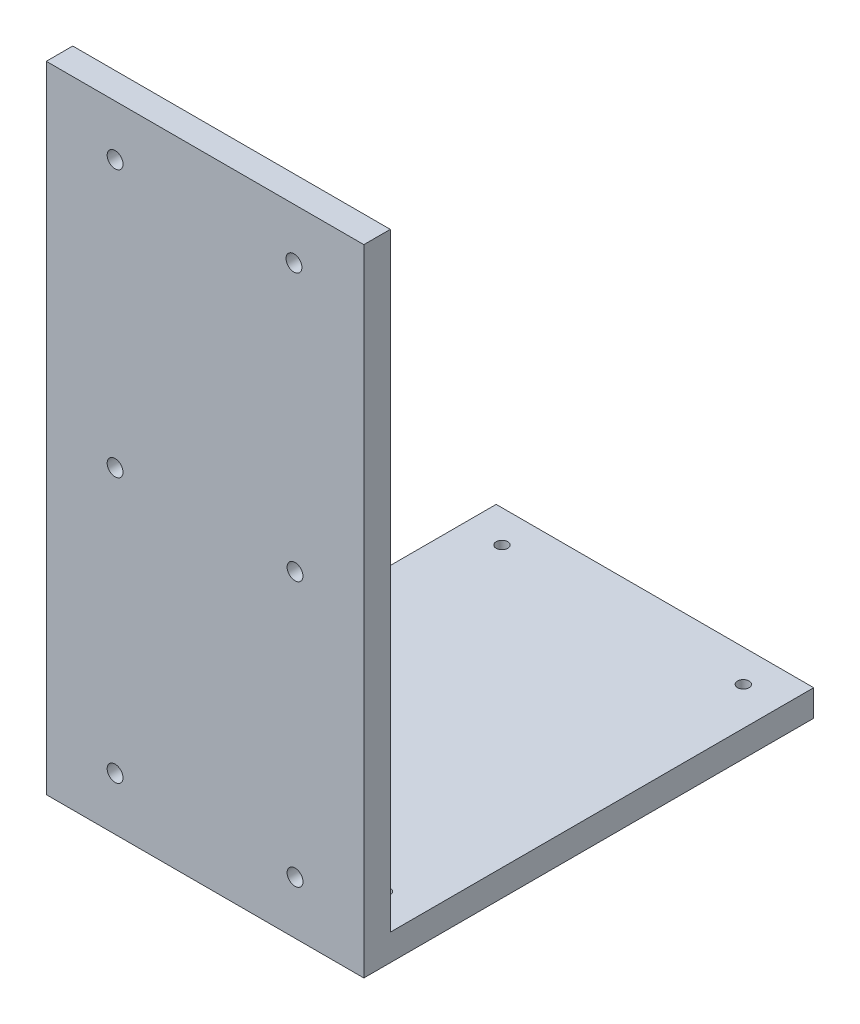
ISO-10303-21;
HEADER;
FILE_DESCRIPTION(('STEP AP214'),'2;1');
FILE_NAME('part.step','',(''),(''),'','','');
FILE_SCHEMA(('AUTOMOTIVE_DESIGN { 1 0 10303 214 1 1 1 1 }'));
ENDSEC;
DATA;
#1=APPLICATION_CONTEXT('core data for automotive mechanical design processes');
#2=APPLICATION_PROTOCOL_DEFINITION('international standard','automotive_design',2000,#1);
#3=PRODUCT_CONTEXT('',#1,'mechanical');
#4=PRODUCT('Part','Part','',(#3));
#5=PRODUCT_RELATED_PRODUCT_CATEGORY('part','',(#4));
#6=PRODUCT_DEFINITION_FORMATION('','',#4);
#7=PRODUCT_DEFINITION_CONTEXT('part definition',#1,'design');
#8=PRODUCT_DEFINITION('design','',#6,#7);
#9=PRODUCT_DEFINITION_SHAPE('','',#8);
#10=(LENGTH_UNIT() NAMED_UNIT(*) SI_UNIT(.MILLI.,.METRE.));
#11=(NAMED_UNIT(*) PLANE_ANGLE_UNIT() SI_UNIT($,.RADIAN.));
#12=(NAMED_UNIT(*) SI_UNIT($,.STERADIAN.) SOLID_ANGLE_UNIT());
#13=UNCERTAINTY_MEASURE_WITH_UNIT(LENGTH_MEASURE(1.E-05),#10,'distance_accuracy_value','');
#14=(GEOMETRIC_REPRESENTATION_CONTEXT(3) GLOBAL_UNCERTAINTY_ASSIGNED_CONTEXT((#13)) GLOBAL_UNIT_ASSIGNED_CONTEXT((#10,
#11,#12)) REPRESENTATION_CONTEXT('',''));
#15=CARTESIAN_POINT('',(0.,0.,0.));
#16=DIRECTION('',(0.,0.,1.));
#17=DIRECTION('',(1.,0.,0.));
#18=AXIS2_PLACEMENT_3D('',#15,#16,#17);
#19=CARTESIAN_POINT('',(-38.1,0.,6.35));
#20=DIRECTION('',(0.,1.,0.));
#21=DIRECTION('',(0.,0.,1.));
#22=AXIS2_PLACEMENT_3D('',#19,#20,#21);
#23=PLANE('',#22);
#24=CARTESIAN_POINT('',(28.956,0.,-7.74700000000002));
#25=DIRECTION('',(0.,1.,0.));
#26=DIRECTION('',(0.,0.,1.));
#27=AXIS2_PLACEMENT_3D('',#24,#25,#26);
#28=CIRCLE('',#27,1.39700000000008);
#29=CARTESIAN_POINT('',(28.956,0.,-6.34999999999994));
#30=VERTEX_POINT('',#29);
#31=EDGE_CURVE('E283',#30,#30,#28,.T.);
#32=ORIENTED_EDGE('',*,*,#31,.T.);
#33=EDGE_LOOP('',(#32));
#34=FACE_BOUND('',#33,.T.);
#35=CARTESIAN_POINT('',(-28.956,0.,-93.853));
#36=DIRECTION('',(0.,1.,0.));
#37=DIRECTION('',(0.,0.,1.));
#38=AXIS2_PLACEMENT_3D('',#35,#36,#37);
#39=CIRCLE('',#38,1.397);
#40=CARTESIAN_POINT('',(-28.956,0.,-92.456));
#41=VERTEX_POINT('',#40);
#42=EDGE_CURVE('E277',#41,#41,#39,.T.);
#43=ORIENTED_EDGE('',*,*,#42,.T.);
#44=EDGE_LOOP('',(#43));
#45=FACE_BOUND('',#44,.T.);
#46=DIRECTION('',(0.,0.,-1.));
#47=VECTOR('',#46,1.);
#48=CARTESIAN_POINT('',(-38.1,0.,6.35));
#49=LINE('',#48,#47);
#50=CARTESIAN_POINT('',(-38.1,0.,6.35));
#51=VERTEX_POINT('',#50);
#52=CARTESIAN_POINT('',(-38.1,0.,-101.6));
#53=VERTEX_POINT('',#52);
#54=EDGE_CURVE('E11',#51,#53,#49,.T.);
#55=ORIENTED_EDGE('',*,*,#54,.T.);
#56=DIRECTION('',(1.,0.,0.));
#57=VECTOR('',#56,1.);
#58=CARTESIAN_POINT('',(38.1,0.,-101.6));
#59=LINE('',#58,#57);
#60=CARTESIAN_POINT('',(38.1,0.,-101.6));
#61=VERTEX_POINT('',#60);
#62=EDGE_CURVE('E118',#53,#61,#59,.T.);
#63=ORIENTED_EDGE('',*,*,#62,.T.);
#64=DIRECTION('',(0.,0.,-1.));
#65=VECTOR('',#64,1.);
#66=CARTESIAN_POINT('',(38.1,0.,6.35));
#67=LINE('',#66,#65);
#68=CARTESIAN_POINT('',(38.1,0.,6.35));
#69=VERTEX_POINT('',#68);
#70=EDGE_CURVE('E49',#69,#61,#67,.T.);
#71=ORIENTED_EDGE('',*,*,#70,.F.);
#72=DIRECTION('',(1.,0.,0.));
#73=VECTOR('',#72,1.);
#74=CARTESIAN_POINT('',(-38.1,0.,6.35));
#75=LINE('',#74,#73);
#76=EDGE_CURVE('E88',#51,#69,#75,.T.);
#77=ORIENTED_EDGE('',*,*,#76,.F.);
#78=EDGE_LOOP('',(#55,#63,#71,#77));
#79=FACE_BOUND('',#78,.T.);
#80=CARTESIAN_POINT('',(-28.956,0.,-7.74700000000002));
#81=DIRECTION('',(0.,-1.,0.));
#82=DIRECTION('',(0.,0.,-1.));
#83=AXIS2_PLACEMENT_3D('',#80,#81,#82);
#84=CIRCLE('',#83,1.39699999999995);
#85=CARTESIAN_POINT('',(-28.956,0.,-9.14399999999997));
#86=VERTEX_POINT('',#85);
#87=EDGE_CURVE('E289',#86,#86,#84,.T.);
#88=ORIENTED_EDGE('',*,*,#87,.F.);
#89=EDGE_LOOP('',(#88));
#90=FACE_BOUND('',#89,.T.);
#91=CARTESIAN_POINT('',(28.956,0.,-93.853));
#92=DIRECTION('',(0.,1.,0.));
#93=DIRECTION('',(0.,0.,1.));
#94=AXIS2_PLACEMENT_3D('',#91,#92,#93);
#95=CIRCLE('',#94,1.39699999999998);
#96=CARTESIAN_POINT('',(28.956,0.,-92.456));
#97=VERTEX_POINT('',#96);
#98=EDGE_CURVE('E272',#97,#97,#95,.F.);
#99=ORIENTED_EDGE('',*,*,#98,.F.);
#100=EDGE_LOOP('',(#99));
#101=FACE_BOUND('',#100,.T.);
#102=ADVANCED_FACE('F39',(#34,#45,#79,#90,#101),#23,.F.);
#103=CARTESIAN_POINT('',(-38.1,6.35,-101.6));
#104=DIRECTION('',(0.,1.,0.));
#105=DIRECTION('',(0.,0.,1.));
#106=AXIS2_PLACEMENT_3D('',#103,#104,#105);
#107=PLANE('',#106);
#108=CARTESIAN_POINT('',(-28.956,6.35,-7.74700000000002));
#109=DIRECTION('',(0.,-1.,0.));
#110=DIRECTION('',(0.,0.,-1.));
#111=AXIS2_PLACEMENT_3D('',#108,#109,#110);
#112=CIRCLE('',#111,1.39699999999995);
#113=CARTESIAN_POINT('',(-28.956,6.35,-9.14399999999997));
#114=VERTEX_POINT('',#113);
#115=EDGE_CURVE('E280',#114,#114,#112,.T.);
#116=ORIENTED_EDGE('',*,*,#115,.T.);
#117=EDGE_LOOP('',(#116));
#118=FACE_BOUND('',#117,.T.);
#119=CARTESIAN_POINT('',(28.956,6.35,-7.74700000000002));
#120=DIRECTION('',(0.,1.,0.));
#121=DIRECTION('',(0.,0.,1.));
#122=AXIS2_PLACEMENT_3D('',#119,#120,#121);
#123=CIRCLE('',#122,1.39700000000008);
#124=CARTESIAN_POINT('',(28.956,6.35,-6.34999999999994));
#125=VERTEX_POINT('',#124);
#126=EDGE_CURVE('E293',#125,#125,#123,.T.);
#127=ORIENTED_EDGE('',*,*,#126,.F.);
#128=EDGE_LOOP('',(#127));
#129=FACE_BOUND('',#128,.T.);
#130=CARTESIAN_POINT('',(-28.956,6.35,-93.853));
#131=DIRECTION('',(0.,1.,0.));
#132=DIRECTION('',(0.,0.,1.));
#133=AXIS2_PLACEMENT_3D('',#130,#131,#132);
#134=CIRCLE('',#133,1.397);
#135=CARTESIAN_POINT('',(-28.956,6.35,-92.456));
#136=VERTEX_POINT('',#135);
#137=EDGE_CURVE('E271',#136,#136,#134,.T.);
#138=ORIENTED_EDGE('',*,*,#137,.F.);
#139=EDGE_LOOP('',(#138));
#140=FACE_BOUND('',#139,.T.);
#141=DIRECTION('',(-1.,0.,0.));
#142=VECTOR('',#141,1.);
#143=CARTESIAN_POINT('',(-38.1,6.35,0.));
#144=LINE('',#143,#142);
#145=CARTESIAN_POINT('',(38.1,6.35,0.));
#146=VERTEX_POINT('',#145);
#147=CARTESIAN_POINT('',(-38.1,6.35000000000005,0.));
#148=VERTEX_POINT('',#147);
#149=EDGE_CURVE('E126',#146,#148,#144,.T.);
#150=ORIENTED_EDGE('',*,*,#149,.F.);
#151=DIRECTION('',(0.,0.,1.));
#152=VECTOR('',#151,1.);
#153=CARTESIAN_POINT('',(38.1,6.35,-101.6));
#154=LINE('',#153,#152);
#155=CARTESIAN_POINT('',(38.1,6.35,-101.6));
#156=VERTEX_POINT('',#155);
#157=EDGE_CURVE('E138',#156,#146,#154,.T.);
#158=ORIENTED_EDGE('',*,*,#157,.F.);
#159=DIRECTION('',(-1.,0.,0.));
#160=VECTOR('',#159,1.);
#161=CARTESIAN_POINT('',(-38.1,6.35,-101.6));
#162=LINE('',#161,#160);
#163=CARTESIAN_POINT('',(-38.1,6.35,-101.6));
#164=VERTEX_POINT('',#163);
#165=EDGE_CURVE('E120',#156,#164,#162,.T.);
#166=ORIENTED_EDGE('',*,*,#165,.T.);
#167=DIRECTION('',(0.,0.,1.));
#168=VECTOR('',#167,1.);
#169=CARTESIAN_POINT('',(-38.1,6.35,-101.6));
#170=LINE('',#169,#168);
#171=EDGE_CURVE('E57',#164,#148,#170,.T.);
#172=ORIENTED_EDGE('',*,*,#171,.T.);
#173=EDGE_LOOP('',(#150,#158,#166,#172));
#174=FACE_BOUND('',#173,.T.);
#175=CARTESIAN_POINT('',(28.956,6.35,-93.853));
#176=DIRECTION('',(0.,1.,0.));
#177=DIRECTION('',(0.,0.,1.));
#178=AXIS2_PLACEMENT_3D('',#175,#176,#177);
#179=CIRCLE('',#178,1.39699999999998);
#180=CARTESIAN_POINT('',(28.956,6.35,-92.456));
#181=VERTEX_POINT('',#180);
#182=EDGE_CURVE('E268',#181,#181,#179,.F.);
#183=ORIENTED_EDGE('',*,*,#182,.T.);
#184=EDGE_LOOP('',(#183));
#185=FACE_BOUND('',#184,.T.);
#186=ADVANCED_FACE('F212',(#118,#129,#140,#174,#185),#107,.T.);
#187=CARTESIAN_POINT('',(-38.1,152.4,6.35));
#188=DIRECTION('',(1.,0.,0.));
#189=DIRECTION('',(0.,1.,0.));
#190=AXIS2_PLACEMENT_3D('',#187,#188,#189);
#191=PLANE('',#190);
#192=DIRECTION('',(0.,-1.,0.));
#193=VECTOR('',#192,1.);
#194=CARTESIAN_POINT('',(-38.1,152.4,0.));
#195=LINE('',#194,#193);
#196=CARTESIAN_POINT('',(-38.1,152.4,0.));
#197=VERTEX_POINT('',#196);
#198=EDGE_CURVE('E142',#197,#148,#195,.T.);
#199=ORIENTED_EDGE('',*,*,#198,.T.);
#200=ORIENTED_EDGE('',*,*,#171,.F.);
#201=DIRECTION('',(0.,-1.,0.));
#202=VECTOR('',#201,1.);
#203=CARTESIAN_POINT('',(-38.1,0.,-101.6));
#204=LINE('',#203,#202);
#205=EDGE_CURVE('E136',#164,#53,#204,.T.);
#206=ORIENTED_EDGE('',*,*,#205,.T.);
#207=ORIENTED_EDGE('',*,*,#54,.F.);
#208=DIRECTION('',(0.,-1.,0.));
#209=VECTOR('',#208,1.);
#210=CARTESIAN_POINT('',(-38.1,152.4,6.35));
#211=LINE('',#210,#209);
#212=CARTESIAN_POINT('',(-38.1,152.4,6.35));
#213=VERTEX_POINT('',#212);
#214=EDGE_CURVE('E145',#213,#51,#211,.T.);
#215=ORIENTED_EDGE('',*,*,#214,.F.);
#216=DIRECTION('',(0.,0.,-1.));
#217=VECTOR('',#216,1.);
#218=CARTESIAN_POINT('',(-38.1,152.4,6.35));
#219=LINE('',#218,#217);
#220=EDGE_CURVE('E154',#213,#197,#219,.T.);
#221=ORIENTED_EDGE('',*,*,#220,.T.);
#222=EDGE_LOOP('',(#199,#200,#206,#207,#215,#221));
#223=FACE_BOUND('',#222,.T.);
#224=ADVANCED_FACE('F41',(#223),#191,.F.);
#225=CARTESIAN_POINT('',(38.1,152.4,6.35));
#226=DIRECTION('',(-1.,0.,0.));
#227=DIRECTION('',(0.,-1.,0.));
#228=AXIS2_PLACEMENT_3D('',#225,#226,#227);
#229=PLANE('',#228);
#230=ORIENTED_EDGE('',*,*,#70,.T.);
#231=DIRECTION('',(0.,1.,0.));
#232=VECTOR('',#231,1.);
#233=CARTESIAN_POINT('',(38.1,6.35,-101.6));
#234=LINE('',#233,#232);
#235=EDGE_CURVE('E106',#61,#156,#234,.T.);
#236=ORIENTED_EDGE('',*,*,#235,.T.);
#237=ORIENTED_EDGE('',*,*,#157,.T.);
#238=DIRECTION('',(0.,1.,0.));
#239=VECTOR('',#238,1.);
#240=CARTESIAN_POINT('',(38.1,152.4,0.));
#241=LINE('',#240,#239);
#242=CARTESIAN_POINT('',(38.1,152.4,0.));
#243=VERTEX_POINT('',#242);
#244=EDGE_CURVE('E158',#146,#243,#241,.T.);
#245=ORIENTED_EDGE('',*,*,#244,.T.);
#246=DIRECTION('',(0.,0.,-1.));
#247=VECTOR('',#246,1.);
#248=CARTESIAN_POINT('',(38.1,152.4,6.35));
#249=LINE('',#248,#247);
#250=CARTESIAN_POINT('',(38.1,152.4,6.35));
#251=VERTEX_POINT('',#250);
#252=EDGE_CURVE('E111',#251,#243,#249,.T.);
#253=ORIENTED_EDGE('',*,*,#252,.F.);
#254=DIRECTION('',(0.,1.,0.));
#255=VECTOR('',#254,1.);
#256=CARTESIAN_POINT('',(38.1,152.4,6.35));
#257=LINE('',#256,#255);
#258=EDGE_CURVE('E108',#69,#251,#257,.T.);
#259=ORIENTED_EDGE('',*,*,#258,.F.);
#260=EDGE_LOOP('',(#230,#236,#237,#245,#253,#259));
#261=FACE_BOUND('',#260,.T.);
#262=ADVANCED_FACE('F105',(#261),#229,.F.);
#263=CARTESIAN_POINT('',(-38.1,152.4,6.35));
#264=DIRECTION('',(0.,-1.,0.));
#265=DIRECTION('',(0.,0.,-1.));
#266=AXIS2_PLACEMENT_3D('',#263,#264,#265);
#267=PLANE('',#266);
#268=DIRECTION('',(-1.,0.,0.));
#269=VECTOR('',#268,1.);
#270=CARTESIAN_POINT('',(-38.1,152.4,0.));
#271=LINE('',#270,#269);
#272=EDGE_CURVE('E81',#243,#197,#271,.T.);
#273=ORIENTED_EDGE('',*,*,#272,.T.);
#274=ORIENTED_EDGE('',*,*,#220,.F.);
#275=DIRECTION('',(-1.,0.,0.));
#276=VECTOR('',#275,1.);
#277=CARTESIAN_POINT('',(-38.1,152.4,6.35));
#278=LINE('',#277,#276);
#279=EDGE_CURVE('E66',#251,#213,#278,.T.);
#280=ORIENTED_EDGE('',*,*,#279,.F.);
#281=ORIENTED_EDGE('',*,*,#252,.T.);
#282=EDGE_LOOP('',(#273,#274,#280,#281));
#283=FACE_BOUND('',#282,.T.);
#284=ADVANCED_FACE('F224',(#283),#267,.F.);
#285=CARTESIAN_POINT('',(0.,0.,6.35));
#286=DIRECTION('',(0.,0.,1.));
#287=DIRECTION('',(1.,0.,0.));
#288=AXIS2_PLACEMENT_3D('',#285,#286,#287);
#289=PLANE('',#288);
#290=CARTESIAN_POINT('',(21.336,140.208,6.35));
#291=DIRECTION('',(0.,0.,1.));
#292=DIRECTION('',(1.,0.,0.));
#293=AXIS2_PLACEMENT_3D('',#290,#291,#292);
#294=CIRCLE('',#293,1.90499999999999);
#295=CARTESIAN_POINT('',(23.241,140.208,6.35));
#296=VERTEX_POINT('',#295);
#297=EDGE_CURVE('E302',#296,#296,#294,.T.);
#298=ORIENTED_EDGE('',*,*,#297,.F.);
#299=EDGE_LOOP('',(#298));
#300=FACE_BOUND('',#299,.T.);
#301=CARTESIAN_POINT('',(21.59,76.2,6.35));
#302=DIRECTION('',(0.,0.,1.));
#303=DIRECTION('',(1.,0.,0.));
#304=AXIS2_PLACEMENT_3D('',#301,#302,#303);
#305=CIRCLE('',#304,1.90500000000001);
#306=CARTESIAN_POINT('',(23.495,76.2,6.35));
#307=VERTEX_POINT('',#306);
#308=EDGE_CURVE('E305',#307,#307,#305,.T.);
#309=ORIENTED_EDGE('',*,*,#308,.F.);
#310=EDGE_LOOP('',(#309));
#311=FACE_BOUND('',#310,.T.);
#312=CARTESIAN_POINT('',(-21.59,76.2,6.35));
#313=DIRECTION('',(0.,0.,1.));
#314=DIRECTION('',(1.,0.,0.));
#315=AXIS2_PLACEMENT_3D('',#312,#313,#314);
#316=CIRCLE('',#315,1.90500000000001);
#317=CARTESIAN_POINT('',(-19.685,76.2,6.35));
#318=VERTEX_POINT('',#317);
#319=EDGE_CURVE('E251',#318,#318,#316,.T.);
#320=ORIENTED_EDGE('',*,*,#319,.F.);
#321=EDGE_LOOP('',(#320));
#322=FACE_BOUND('',#321,.T.);
#323=CARTESIAN_POINT('',(-21.59,12.7,6.35));
#324=DIRECTION('',(0.,0.,1.));
#325=DIRECTION('',(1.,0.,0.));
#326=AXIS2_PLACEMENT_3D('',#323,#324,#325);
#327=CIRCLE('',#326,1.905);
#328=CARTESIAN_POINT('',(-19.685,12.7,6.35));
#329=VERTEX_POINT('',#328);
#330=EDGE_CURVE('E301',#329,#329,#327,.T.);
#331=ORIENTED_EDGE('',*,*,#330,.F.);
#332=EDGE_LOOP('',(#331));
#333=FACE_BOUND('',#332,.T.);
#334=CARTESIAN_POINT('',(21.59,12.7,6.35));
#335=DIRECTION('',(0.,0.,1.));
#336=DIRECTION('',(1.,0.,0.));
#337=AXIS2_PLACEMENT_3D('',#334,#335,#336);
#338=CIRCLE('',#337,1.905);
#339=CARTESIAN_POINT('',(23.495,12.7,6.35));
#340=VERTEX_POINT('',#339);
#341=EDGE_CURVE('E296',#340,#340,#338,.T.);
#342=ORIENTED_EDGE('',*,*,#341,.F.);
#343=EDGE_LOOP('',(#342));
#344=FACE_BOUND('',#343,.T.);
#345=CARTESIAN_POINT('',(-21.59,140.208,6.35));
#346=DIRECTION('',(0.,0.,1.));
#347=DIRECTION('',(1.,0.,0.));
#348=AXIS2_PLACEMENT_3D('',#345,#346,#347);
#349=CIRCLE('',#348,1.90499999999999);
#350=CARTESIAN_POINT('',(-19.685,140.208,6.35));
#351=VERTEX_POINT('',#350);
#352=EDGE_CURVE('E131',#351,#351,#349,.T.);
#353=ORIENTED_EDGE('',*,*,#352,.F.);
#354=EDGE_LOOP('',(#353));
#355=FACE_BOUND('',#354,.T.);
#356=ORIENTED_EDGE('',*,*,#214,.T.);
#357=ORIENTED_EDGE('',*,*,#76,.T.);
#358=ORIENTED_EDGE('',*,*,#258,.T.);
#359=ORIENTED_EDGE('',*,*,#279,.T.);
#360=EDGE_LOOP('',(#356,#357,#358,#359));
#361=FACE_BOUND('',#360,.T.);
#362=ADVANCED_FACE('F227',(#300,#311,#322,#333,#344,#355,#361),#289,.T.);
#363=CARTESIAN_POINT('',(0.,0.,0.));
#364=DIRECTION('',(0.,0.,1.));
#365=DIRECTION('',(1.,0.,0.));
#366=AXIS2_PLACEMENT_3D('',#363,#364,#365);
#367=PLANE('',#366);
#368=CARTESIAN_POINT('',(21.336,140.208,0.));
#369=DIRECTION('',(0.,0.,1.));
#370=DIRECTION('',(1.,0.,0.));
#371=AXIS2_PLACEMENT_3D('',#368,#369,#370);
#372=CIRCLE('',#371,1.90499999999999);
#373=CARTESIAN_POINT('',(23.241,140.208,0.));
#374=VERTEX_POINT('',#373);
#375=EDGE_CURVE('E43',#374,#374,#372,.T.);
#376=ORIENTED_EDGE('',*,*,#375,.T.);
#377=EDGE_LOOP('',(#376));
#378=FACE_BOUND('',#377,.T.);
#379=CARTESIAN_POINT('',(21.59,76.2,0.));
#380=DIRECTION('',(0.,0.,1.));
#381=DIRECTION('',(1.,0.,0.));
#382=AXIS2_PLACEMENT_3D('',#379,#380,#381);
#383=CIRCLE('',#382,1.90500000000001);
#384=CARTESIAN_POINT('',(23.495,76.2,0.));
#385=VERTEX_POINT('',#384);
#386=EDGE_CURVE('E182',#385,#385,#383,.T.);
#387=ORIENTED_EDGE('',*,*,#386,.T.);
#388=EDGE_LOOP('',(#387));
#389=FACE_BOUND('',#388,.T.);
#390=CARTESIAN_POINT('',(-21.59,76.2,0.));
#391=DIRECTION('',(0.,0.,1.));
#392=DIRECTION('',(1.,0.,0.));
#393=AXIS2_PLACEMENT_3D('',#390,#391,#392);
#394=CIRCLE('',#393,1.90500000000001);
#395=CARTESIAN_POINT('',(-19.685,76.2,0.));
#396=VERTEX_POINT('',#395);
#397=EDGE_CURVE('E179',#396,#396,#394,.T.);
#398=ORIENTED_EDGE('',*,*,#397,.T.);
#399=EDGE_LOOP('',(#398));
#400=FACE_BOUND('',#399,.T.);
#401=CARTESIAN_POINT('',(-21.59,12.7,0.));
#402=DIRECTION('',(0.,0.,1.));
#403=DIRECTION('',(1.,0.,0.));
#404=AXIS2_PLACEMENT_3D('',#401,#402,#403);
#405=CIRCLE('',#404,1.905);
#406=CARTESIAN_POINT('',(-19.685,12.7,0.));
#407=VERTEX_POINT('',#406);
#408=EDGE_CURVE('E175',#407,#407,#405,.T.);
#409=ORIENTED_EDGE('',*,*,#408,.T.);
#410=EDGE_LOOP('',(#409));
#411=FACE_BOUND('',#410,.T.);
#412=CARTESIAN_POINT('',(21.59,12.7,0.));
#413=DIRECTION('',(0.,0.,1.));
#414=DIRECTION('',(1.,0.,0.));
#415=AXIS2_PLACEMENT_3D('',#412,#413,#414);
#416=CIRCLE('',#415,1.905);
#417=CARTESIAN_POINT('',(23.495,12.7,0.));
#418=VERTEX_POINT('',#417);
#419=EDGE_CURVE('E171',#418,#418,#416,.T.);
#420=ORIENTED_EDGE('',*,*,#419,.T.);
#421=EDGE_LOOP('',(#420));
#422=FACE_BOUND('',#421,.T.);
#423=CARTESIAN_POINT('',(-21.59,140.208,0.));
#424=DIRECTION('',(0.,0.,1.));
#425=DIRECTION('',(1.,0.,0.));
#426=AXIS2_PLACEMENT_3D('',#423,#424,#425);
#427=CIRCLE('',#426,1.90499999999999);
#428=CARTESIAN_POINT('',(-19.685,140.208,0.));
#429=VERTEX_POINT('',#428);
#430=EDGE_CURVE('E167',#429,#429,#427,.T.);
#431=ORIENTED_EDGE('',*,*,#430,.T.);
#432=EDGE_LOOP('',(#431));
#433=FACE_BOUND('',#432,.T.);
#434=ORIENTED_EDGE('',*,*,#244,.F.);
#435=ORIENTED_EDGE('',*,*,#149,.T.);
#436=ORIENTED_EDGE('',*,*,#198,.F.);
#437=ORIENTED_EDGE('',*,*,#272,.F.);
#438=EDGE_LOOP('',(#434,#435,#436,#437));
#439=FACE_BOUND('',#438,.T.);
#440=ADVANCED_FACE('F191',(#378,#389,#400,#411,#422,#433,#439),#367,.F.);
#441=CARTESIAN_POINT('',(0.,0.,-101.6));
#442=DIRECTION('',(0.,0.,-1.));
#443=DIRECTION('',(-1.,0.,0.));
#444=AXIS2_PLACEMENT_3D('',#441,#442,#443);
#445=PLANE('',#444);
#446=ORIENTED_EDGE('',*,*,#62,.F.);
#447=ORIENTED_EDGE('',*,*,#205,.F.);
#448=ORIENTED_EDGE('',*,*,#165,.F.);
#449=ORIENTED_EDGE('',*,*,#235,.F.);
#450=EDGE_LOOP('',(#446,#447,#448,#449));
#451=FACE_BOUND('',#450,.T.);
#452=ADVANCED_FACE('F116',(#451),#445,.T.);
#453=CARTESIAN_POINT('',(-21.59,140.208,-101.6));
#454=DIRECTION('',(0.,0.,1.));
#455=DIRECTION('',(1.,0.,0.));
#456=AXIS2_PLACEMENT_3D('',#453,#454,#455);
#457=CYLINDRICAL_SURFACE('',#456,1.90499999999999);
#458=ORIENTED_EDGE('',*,*,#352,.T.);
#459=EDGE_LOOP('',(#458));
#460=FACE_BOUND('',#459,.T.);
#461=ORIENTED_EDGE('',*,*,#430,.F.);
#462=EDGE_LOOP('',(#461));
#463=FACE_BOUND('',#462,.T.);
#464=ADVANCED_FACE('F235',(#460,#463),#457,.F.);
#465=CARTESIAN_POINT('',(21.59,12.7,-101.6));
#466=DIRECTION('',(0.,0.,1.));
#467=DIRECTION('',(1.,0.,0.));
#468=AXIS2_PLACEMENT_3D('',#465,#466,#467);
#469=CYLINDRICAL_SURFACE('',#468,1.905);
#470=ORIENTED_EDGE('',*,*,#341,.T.);
#471=EDGE_LOOP('',(#470));
#472=FACE_BOUND('',#471,.T.);
#473=ORIENTED_EDGE('',*,*,#419,.F.);
#474=EDGE_LOOP('',(#473));
#475=FACE_BOUND('',#474,.T.);
#476=ADVANCED_FACE('F238',(#472,#475),#469,.F.);
#477=CARTESIAN_POINT('',(-21.59,12.7,-101.6));
#478=DIRECTION('',(0.,0.,1.));
#479=DIRECTION('',(1.,0.,0.));
#480=AXIS2_PLACEMENT_3D('',#477,#478,#479);
#481=CYLINDRICAL_SURFACE('',#480,1.905);
#482=ORIENTED_EDGE('',*,*,#330,.T.);
#483=EDGE_LOOP('',(#482));
#484=FACE_BOUND('',#483,.T.);
#485=ORIENTED_EDGE('',*,*,#408,.F.);
#486=EDGE_LOOP('',(#485));
#487=FACE_BOUND('',#486,.T.);
#488=ADVANCED_FACE('F240',(#484,#487),#481,.F.);
#489=CARTESIAN_POINT('',(-21.59,76.2,-101.6));
#490=DIRECTION('',(0.,0.,1.));
#491=DIRECTION('',(1.,0.,0.));
#492=AXIS2_PLACEMENT_3D('',#489,#490,#491);
#493=CYLINDRICAL_SURFACE('',#492,1.90500000000001);
#494=ORIENTED_EDGE('',*,*,#319,.T.);
#495=EDGE_LOOP('',(#494));
#496=FACE_BOUND('',#495,.T.);
#497=ORIENTED_EDGE('',*,*,#397,.F.);
#498=EDGE_LOOP('',(#497));
#499=FACE_BOUND('',#498,.T.);
#500=ADVANCED_FACE('F206',(#496,#499),#493,.F.);
#501=CARTESIAN_POINT('',(21.59,76.2,-101.6));
#502=DIRECTION('',(0.,0.,1.));
#503=DIRECTION('',(1.,0.,0.));
#504=AXIS2_PLACEMENT_3D('',#501,#502,#503);
#505=CYLINDRICAL_SURFACE('',#504,1.90500000000001);
#506=ORIENTED_EDGE('',*,*,#308,.T.);
#507=EDGE_LOOP('',(#506));
#508=FACE_BOUND('',#507,.T.);
#509=ORIENTED_EDGE('',*,*,#386,.F.);
#510=EDGE_LOOP('',(#509));
#511=FACE_BOUND('',#510,.T.);
#512=ADVANCED_FACE('F196',(#508,#511),#505,.F.);
#513=CARTESIAN_POINT('',(21.336,140.208,-101.6));
#514=DIRECTION('',(0.,0.,1.));
#515=DIRECTION('',(1.,0.,0.));
#516=AXIS2_PLACEMENT_3D('',#513,#514,#515);
#517=CYLINDRICAL_SURFACE('',#516,1.90499999999999);
#518=ORIENTED_EDGE('',*,*,#297,.T.);
#519=EDGE_LOOP('',(#518));
#520=FACE_BOUND('',#519,.T.);
#521=ORIENTED_EDGE('',*,*,#375,.F.);
#522=EDGE_LOOP('',(#521));
#523=FACE_BOUND('',#522,.T.);
#524=ADVANCED_FACE('F193',(#520,#523),#517,.F.);
#525=CARTESIAN_POINT('',(-28.956,0.,-93.853));
#526=DIRECTION('',(0.,1.,0.));
#527=DIRECTION('',(0.,0.,1.));
#528=AXIS2_PLACEMENT_3D('',#525,#526,#527);
#529=CYLINDRICAL_SURFACE('',#528,1.397);
#530=ORIENTED_EDGE('',*,*,#42,.F.);
#531=EDGE_LOOP('',(#530));
#532=FACE_BOUND('',#531,.T.);
#533=ORIENTED_EDGE('',*,*,#137,.T.);
#534=EDGE_LOOP('',(#533));
#535=FACE_BOUND('',#534,.T.);
#536=ADVANCED_FACE('F195',(#532,#535),#529,.F.);
#537=CARTESIAN_POINT('',(28.956,0.,-7.74700000000002));
#538=DIRECTION('',(0.,1.,0.));
#539=DIRECTION('',(0.,0.,1.));
#540=AXIS2_PLACEMENT_3D('',#537,#538,#539);
#541=CYLINDRICAL_SURFACE('',#540,1.39700000000008);
#542=ORIENTED_EDGE('',*,*,#31,.F.);
#543=EDGE_LOOP('',(#542));
#544=FACE_BOUND('',#543,.T.);
#545=ORIENTED_EDGE('',*,*,#126,.T.);
#546=EDGE_LOOP('',(#545));
#547=FACE_BOUND('',#546,.T.);
#548=ADVANCED_FACE('F203',(#544,#547),#541,.F.);
#549=CARTESIAN_POINT('',(-28.956,0.,-7.74700000000002));
#550=DIRECTION('',(0.,1.,0.));
#551=DIRECTION('',(0.,0.,1.));
#552=AXIS2_PLACEMENT_3D('',#549,#550,#551);
#553=CYLINDRICAL_SURFACE('',#552,1.39699999999995);
#554=ORIENTED_EDGE('',*,*,#87,.T.);
#555=EDGE_LOOP('',(#554));
#556=FACE_BOUND('',#555,.T.);
#557=ORIENTED_EDGE('',*,*,#115,.F.);
#558=EDGE_LOOP('',(#557));
#559=FACE_BOUND('',#558,.T.);
#560=ADVANCED_FACE('F328',(#556,#559),#553,.F.);
#561=CARTESIAN_POINT('',(28.956,0.,-93.853));
#562=DIRECTION('',(0.,1.,0.));
#563=DIRECTION('',(0.,0.,1.));
#564=AXIS2_PLACEMENT_3D('',#561,#562,#563);
#565=CYLINDRICAL_SURFACE('',#564,1.39699999999998);
#566=ORIENTED_EDGE('',*,*,#98,.T.);
#567=EDGE_LOOP('',(#566));
#568=FACE_BOUND('',#567,.T.);
#569=ORIENTED_EDGE('',*,*,#182,.F.);
#570=EDGE_LOOP('',(#569));
#571=FACE_BOUND('',#570,.T.);
#572=ADVANCED_FACE('F331',(#568,#571),#565,.F.);
#573=CLOSED_SHELL('',(#102,#186,#224,#262,#284,#362,#440,#452,#464,#476,#488,#500,#512,#524,
#536,#548,#560,#572));
#574=MANIFOLD_SOLID_BREP('B2',#573);
#575=ADVANCED_BREP_SHAPE_REPRESENTATION('',(#18,#574),#14);
#576=SHAPE_DEFINITION_REPRESENTATION(#9,#575);
ENDSEC;
END-ISO-10303-21;
